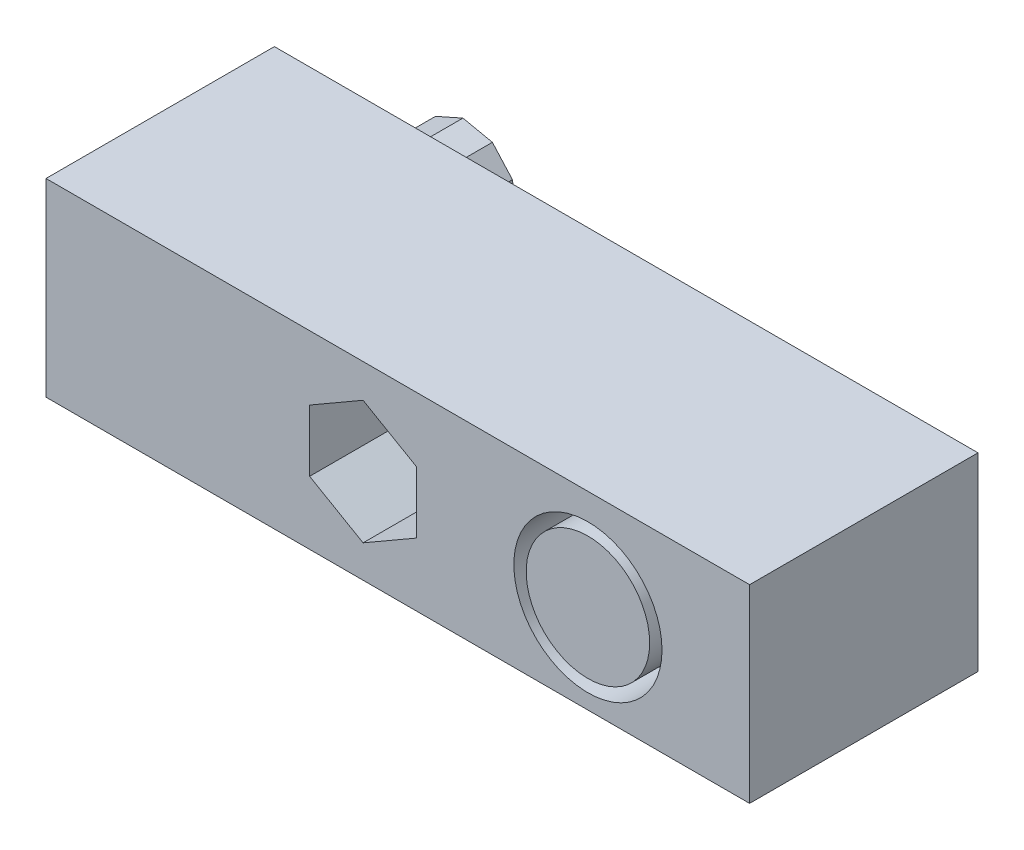
ISO-10303-21;
HEADER;
FILE_DESCRIPTION(('STEP AP214'),'2;1');
FILE_NAME('part.step','',(''),(''),'','','');
FILE_SCHEMA(('AUTOMOTIVE_DESIGN { 1 0 10303 214 1 1 1 1 }'));
ENDSEC;
DATA;
#1=APPLICATION_CONTEXT('core data for automotive mechanical design processes');
#2=APPLICATION_PROTOCOL_DEFINITION('international standard','automotive_design',2000,#1);
#3=PRODUCT_CONTEXT('',#1,'mechanical');
#4=PRODUCT('Part','Part','',(#3));
#5=PRODUCT_RELATED_PRODUCT_CATEGORY('part','',(#4));
#6=PRODUCT_DEFINITION_FORMATION('','',#4);
#7=PRODUCT_DEFINITION_CONTEXT('part definition',#1,'design');
#8=PRODUCT_DEFINITION('design','',#6,#7);
#9=PRODUCT_DEFINITION_SHAPE('','',#8);
#10=(LENGTH_UNIT() NAMED_UNIT(*) SI_UNIT(.MILLI.,.METRE.));
#11=(NAMED_UNIT(*) PLANE_ANGLE_UNIT() SI_UNIT($,.RADIAN.));
#12=(NAMED_UNIT(*) SI_UNIT($,.STERADIAN.) SOLID_ANGLE_UNIT());
#13=UNCERTAINTY_MEASURE_WITH_UNIT(LENGTH_MEASURE(1.E-05),#10,'distance_accuracy_value','');
#14=(GEOMETRIC_REPRESENTATION_CONTEXT(3) GLOBAL_UNCERTAINTY_ASSIGNED_CONTEXT((#13)) GLOBAL_UNIT_ASSIGNED_CONTEXT((#10,
#11,#12)) REPRESENTATION_CONTEXT('',''));
#15=CARTESIAN_POINT('',(0.,0.,0.));
#16=DIRECTION('',(0.,0.,1.));
#17=DIRECTION('',(1.,0.,0.));
#18=AXIS2_PLACEMENT_3D('',#15,#16,#17);
#19=CARTESIAN_POINT('',(0.,0.,0.));
#20=DIRECTION('',(0.,0.,1.));
#21=DIRECTION('',(1.,0.,0.));
#22=AXIS2_PLACEMENT_3D('',#19,#20,#21);
#23=PLANE('',#22);
#24=CARTESIAN_POINT('',(36.4253404546133,-3.65790400571697,0.));
#25=DIRECTION('',(0.,0.,1.));
#26=DIRECTION('',(1.,0.,0.));
#27=AXIS2_PLACEMENT_3D('',#24,#25,#26);
#28=CIRCLE('',#27,12.);
#29=CARTESIAN_POINT('',(48.4253404546133,-3.65790400571697,0.));
#30=VERTEX_POINT('',#29);
#31=EDGE_CURVE('E47',#30,#30,#28,.T.);
#32=ORIENTED_EDGE('',*,*,#31,.T.);
#33=EDGE_LOOP('',(#32));
#34=FACE_BOUND('',#33,.T.);
#35=DIRECTION('',(-0.866025403784439,-0.499999999999999,0.));
#36=VECTOR('',#35,1.);
#37=CARTESIAN_POINT('',(0.,7.16721621822201,0.));
#38=LINE('',#37,#36);
#39=CARTESIAN_POINT('',(0.,7.16721621822201,0.));
#40=VERTEX_POINT('',#39);
#41=CARTESIAN_POINT('',(-8.66025403784439,2.16721621822202,0.));
#42=VERTEX_POINT('',#41);
#43=EDGE_CURVE('E408',#40,#42,#38,.T.);
#44=ORIENTED_EDGE('',*,*,#43,.T.);
#45=DIRECTION('',(0.,-1.,0.));
#46=VECTOR('',#45,1.);
#47=CARTESIAN_POINT('',(-8.66025403784439,2.16721621822202,0.));
#48=LINE('',#47,#46);
#49=CARTESIAN_POINT('',(-8.66025403784439,-7.83278378177798,0.));
#50=VERTEX_POINT('',#49);
#51=EDGE_CURVE('E411',#42,#50,#48,.T.);
#52=ORIENTED_EDGE('',*,*,#51,.T.);
#53=DIRECTION('',(0.866025403784439,-0.5,0.));
#54=VECTOR('',#53,1.);
#55=CARTESIAN_POINT('',(-8.66025403784439,-7.83278378177798,0.));
#56=LINE('',#55,#54);
#57=CARTESIAN_POINT('',(0.,-12.832783781778,0.));
#58=VERTEX_POINT('',#57);
#59=EDGE_CURVE('E420',#50,#58,#56,.T.);
#60=ORIENTED_EDGE('',*,*,#59,.T.);
#61=DIRECTION('',(0.866025403784438,0.5,0.));
#62=VECTOR('',#61,1.);
#63=CARTESIAN_POINT('',(0.,-12.832783781778,0.));
#64=LINE('',#63,#62);
#65=CARTESIAN_POINT('',(8.66025403784439,-7.83278378177798,0.));
#66=VERTEX_POINT('',#65);
#67=EDGE_CURVE('E417',#58,#66,#64,.T.);
#68=ORIENTED_EDGE('',*,*,#67,.T.);
#69=DIRECTION('',(0.,1.,0.));
#70=VECTOR('',#69,1.);
#71=CARTESIAN_POINT('',(8.66025403784439,-7.83278378177798,0.));
#72=LINE('',#71,#70);
#73=CARTESIAN_POINT('',(8.66025403784439,2.16721621822202,0.));
#74=VERTEX_POINT('',#73);
#75=EDGE_CURVE('E414',#66,#74,#72,.T.);
#76=ORIENTED_EDGE('',*,*,#75,.T.);
#77=DIRECTION('',(-0.866025403784439,0.5,0.));
#78=VECTOR('',#77,1.);
#79=CARTESIAN_POINT('',(8.66025403784439,2.16721621822202,0.));
#80=LINE('',#79,#78);
#81=EDGE_CURVE('E407',#74,#40,#80,.T.);
#82=ORIENTED_EDGE('',*,*,#81,.T.);
#83=EDGE_LOOP('',(#44,#52,#60,#68,#76,#82));
#84=FACE_BOUND('',#83,.T.);
#85=DIRECTION('',(0.,-1.,0.));
#86=VECTOR('',#85,1.);
#87=CARTESIAN_POINT('',(-51.3648384094754,12.6032994923858,0.));
#88=LINE('',#87,#86);
#89=CARTESIAN_POINT('',(-51.3648384094754,12.6032994923858,0.));
#90=VERTEX_POINT('',#89);
#91=CARTESIAN_POINT('',(-51.3648384094754,-18.0829949238579,0.));
#92=VERTEX_POINT('',#91);
#93=EDGE_CURVE('E348',#90,#92,#88,.T.);
#94=ORIENTED_EDGE('',*,*,#93,.F.);
#95=DIRECTION('',(-1.,0.,0.));
#96=VECTOR('',#95,1.);
#97=CARTESIAN_POINT('',(-51.3648384094754,12.6032994923858,0.));
#98=LINE('',#97,#96);
#99=CARTESIAN_POINT('',(62.6128265651438,12.6032994923858,0.));
#100=VERTEX_POINT('',#99);
#101=EDGE_CURVE('E357',#100,#90,#98,.T.);
#102=ORIENTED_EDGE('',*,*,#101,.F.);
#103=DIRECTION('',(0.,1.,0.));
#104=VECTOR('',#103,1.);
#105=CARTESIAN_POINT('',(62.6128265651438,12.6032994923858,0.));
#106=LINE('',#105,#104);
#107=CARTESIAN_POINT('',(62.6128265651438,-18.0829949238579,0.));
#108=VERTEX_POINT('',#107);
#109=EDGE_CURVE('E352',#108,#100,#106,.T.);
#110=ORIENTED_EDGE('',*,*,#109,.F.);
#111=DIRECTION('',(1.,0.,0.));
#112=VECTOR('',#111,1.);
#113=CARTESIAN_POINT('',(-51.3648384094754,-18.0829949238579,0.));
#114=LINE('',#113,#112);
#115=EDGE_CURVE('E353',#92,#108,#114,.T.);
#116=ORIENTED_EDGE('',*,*,#115,.F.);
#117=EDGE_LOOP('',(#94,#102,#110,#116));
#118=FACE_BOUND('',#117,.T.);
#119=DIRECTION('',(-0.978147600733811,0.207911690817733,0.));
#120=VECTOR('',#119,1.);
#121=CARTESIAN_POINT('',(-29.1756920213731,-7.84276653118196,0.));
#122=LINE('',#121,#120);
#123=CARTESIAN_POINT('',(-29.1756920213731,-7.84276653118196,0.));
#124=VERTEX_POINT('',#123);
#125=CARTESIAN_POINT('',(-33.9429833408936,-6.82944747982547,0.));
#126=VERTEX_POINT('',#125);
#127=EDGE_CURVE('E234',#124,#126,#122,.T.);
#128=ORIENTED_EDGE('',*,*,#127,.F.);
#129=DIRECTION('',(-0.913545457642611,-0.406736643075776,0.));
#130=VECTOR('',#129,1.);
#131=CARTESIAN_POINT('',(-24.7232583324902,-5.86041533345733,0.));
#132=LINE('',#131,#130);
#133=CARTESIAN_POINT('',(-24.7232583324902,-5.86041533345734,0.));
#134=VERTEX_POINT('',#133);
#135=EDGE_CURVE('E277',#134,#124,#132,.T.);
#136=ORIENTED_EDGE('',*,*,#135,.F.);
#137=DIRECTION('',(-0.500000000000021,-0.866025403784427,0.));
#138=VECTOR('',#137,1.);
#139=CARTESIAN_POINT('',(-22.2863606107433,-1.63958466654304,0.));
#140=LINE('',#139,#138);
#141=CARTESIAN_POINT('',(-22.2863606107433,-1.63958466654304,0.));
#142=VERTEX_POINT('',#141);
#143=EDGE_CURVE('E315',#142,#134,#140,.T.);
#144=ORIENTED_EDGE('',*,*,#143,.F.);
#145=DIRECTION('',(0.104528463267631,-0.994521895368276,0.));
#146=VECTOR('',#145,1.);
#147=CARTESIAN_POINT('',(-22.7958109587324,3.20751161555752,0.));
#148=LINE('',#147,#146);
#149=CARTESIAN_POINT('',(-22.7958109587324,3.20751161555752,0.));
#150=VERTEX_POINT('',#149);
#151=EDGE_CURVE('E312',#150,#142,#148,.T.);
#152=ORIENTED_EDGE('',*,*,#151,.F.);
#153=DIRECTION('',(0.669130606358842,-0.743144825477409,0.));
#154=VECTOR('',#153,1.);
#155=CARTESIAN_POINT('',(-26.0570166591063,6.8294474798252,0.));
#156=LINE('',#155,#154);
#157=CARTESIAN_POINT('',(-26.0570166591063,6.8294474798252,0.));
#158=VERTEX_POINT('',#157);
#159=EDGE_CURVE('E309',#158,#150,#156,.T.);
#160=ORIENTED_EDGE('',*,*,#159,.F.);
#161=DIRECTION('',(0.978147600733811,-0.207911690817735,0.));
#162=VECTOR('',#161,1.);
#163=CARTESIAN_POINT('',(-30.8243079786272,7.84276653118177,0.));
#164=LINE('',#163,#162);
#165=CARTESIAN_POINT('',(-30.8243079786272,7.84276653118177,0.));
#166=VERTEX_POINT('',#165);
#167=EDGE_CURVE('E306',#166,#158,#164,.T.);
#168=ORIENTED_EDGE('',*,*,#167,.F.);
#169=DIRECTION('',(0.913545457642601,0.406736643075799,0.));
#170=VECTOR('',#169,1.);
#171=CARTESIAN_POINT('',(-35.27674166751,5.86041533345704,0.));
#172=LINE('',#171,#170);
#173=CARTESIAN_POINT('',(-35.27674166751,5.86041533345704,0.));
#174=VERTEX_POINT('',#173);
#175=EDGE_CURVE('E303',#174,#166,#172,.T.);
#176=ORIENTED_EDGE('',*,*,#175,.F.);
#177=DIRECTION('',(0.5,0.866025403784439,0.));
#178=VECTOR('',#177,1.);
#179=CARTESIAN_POINT('',(-37.7136393892568,1.63958466654269,0.));
#180=LINE('',#179,#178);
#181=CARTESIAN_POINT('',(-37.7136393892568,1.63958466654269,0.));
#182=VERTEX_POINT('',#181);
#183=EDGE_CURVE('E300',#182,#174,#180,.T.);
#184=ORIENTED_EDGE('',*,*,#183,.F.);
#185=DIRECTION('',(-0.104528463267654,0.994521895368273,0.));
#186=VECTOR('',#185,1.);
#187=CARTESIAN_POINT('',(-37.2041890412675,-3.20751161555786,0.));
#188=LINE('',#187,#186);
#189=CARTESIAN_POINT('',(-37.2041890412675,-3.20751161555786,0.));
#190=VERTEX_POINT('',#189);
#191=EDGE_CURVE('E64',#190,#182,#188,.T.);
#192=ORIENTED_EDGE('',*,*,#191,.F.);
#193=DIRECTION('',(-0.669130606358858,0.743144825477394,0.));
#194=VECTOR('',#193,1.);
#195=CARTESIAN_POINT('',(-33.9429833408936,-6.82944747982547,0.));
#196=LINE('',#195,#194);
#197=EDGE_CURVE('E59',#126,#190,#196,.T.);
#198=ORIENTED_EDGE('',*,*,#197,.F.);
#199=EDGE_LOOP('',(#128,#136,#144,#152,#160,#168,#176,#184,#192,#198));
#200=FACE_BOUND('',#199,.T.);
#201=ADVANCED_FACE('F43',(#34,#84,#118,#200),#23,.F.);
#202=CARTESIAN_POINT('',(-51.3648384094754,12.6032994923858,37.));
#203=DIRECTION('',(1.,0.,0.));
#204=DIRECTION('',(0.,0.,-1.));
#205=AXIS2_PLACEMENT_3D('',#202,#203,#204);
#206=PLANE('',#205);
#207=ORIENTED_EDGE('',*,*,#93,.T.);
#208=DIRECTION('',(0.,0.,-1.));
#209=VECTOR('',#208,1.);
#210=CARTESIAN_POINT('',(-51.3648384094754,-18.0829949238579,37.));
#211=LINE('',#210,#209);
#212=CARTESIAN_POINT('',(-51.3648384094754,-18.0829949238579,37.));
#213=VERTEX_POINT('',#212);
#214=EDGE_CURVE('E349',#213,#92,#211,.T.);
#215=ORIENTED_EDGE('',*,*,#214,.F.);
#216=DIRECTION('',(0.,-1.,0.));
#217=VECTOR('',#216,1.);
#218=CARTESIAN_POINT('',(-51.3648384094754,12.6032994923858,37.));
#219=LINE('',#218,#217);
#220=CARTESIAN_POINT('',(-51.3648384094754,12.6032994923858,37.));
#221=VERTEX_POINT('',#220);
#222=EDGE_CURVE('E361',#221,#213,#219,.T.);
#223=ORIENTED_EDGE('',*,*,#222,.F.);
#224=DIRECTION('',(0.,0.,-1.));
#225=VECTOR('',#224,1.);
#226=CARTESIAN_POINT('',(-51.3648384094754,12.6032994923858,37.));
#227=LINE('',#226,#225);
#228=EDGE_CURVE('E362',#221,#90,#227,.T.);
#229=ORIENTED_EDGE('',*,*,#228,.T.);
#230=EDGE_LOOP('',(#207,#215,#223,#229));
#231=FACE_BOUND('',#230,.T.);
#232=ADVANCED_FACE('F461',(#231),#206,.F.);
#233=CARTESIAN_POINT('',(-51.3648384094754,-18.0829949238579,37.));
#234=DIRECTION('',(0.,1.,0.));
#235=DIRECTION('',(0.,0.,1.));
#236=AXIS2_PLACEMENT_3D('',#233,#234,#235);
#237=PLANE('',#236);
#238=ORIENTED_EDGE('',*,*,#115,.T.);
#239=DIRECTION('',(0.,0.,-1.));
#240=VECTOR('',#239,1.);
#241=CARTESIAN_POINT('',(62.6128265651438,-18.0829949238579,37.));
#242=LINE('',#241,#240);
#243=CARTESIAN_POINT('',(62.6128265651438,-18.0829949238579,37.));
#244=VERTEX_POINT('',#243);
#245=EDGE_CURVE('E354',#244,#108,#242,.T.);
#246=ORIENTED_EDGE('',*,*,#245,.F.);
#247=DIRECTION('',(1.,0.,0.));
#248=VECTOR('',#247,1.);
#249=CARTESIAN_POINT('',(-51.3648384094754,-18.0829949238579,37.));
#250=LINE('',#249,#248);
#251=EDGE_CURVE('E374',#213,#244,#250,.T.);
#252=ORIENTED_EDGE('',*,*,#251,.F.);
#253=ORIENTED_EDGE('',*,*,#214,.T.);
#254=EDGE_LOOP('',(#238,#246,#252,#253));
#255=FACE_BOUND('',#254,.T.);
#256=ADVANCED_FACE('F464',(#255),#237,.F.);
#257=CARTESIAN_POINT('',(62.6128265651438,12.6032994923858,37.));
#258=DIRECTION('',(-1.,0.,0.));
#259=DIRECTION('',(0.,0.,1.));
#260=AXIS2_PLACEMENT_3D('',#257,#258,#259);
#261=PLANE('',#260);
#262=ORIENTED_EDGE('',*,*,#109,.T.);
#263=DIRECTION('',(0.,0.,-1.));
#264=VECTOR('',#263,1.);
#265=CARTESIAN_POINT('',(62.6128265651438,12.6032994923858,37.));
#266=LINE('',#265,#264);
#267=CARTESIAN_POINT('',(62.6128265651438,12.6032994923858,37.));
#268=VERTEX_POINT('',#267);
#269=EDGE_CURVE('E358',#268,#100,#266,.T.);
#270=ORIENTED_EDGE('',*,*,#269,.F.);
#271=DIRECTION('',(0.,1.,0.));
#272=VECTOR('',#271,1.);
#273=CARTESIAN_POINT('',(62.6128265651438,12.6032994923858,37.));
#274=LINE('',#273,#272);
#275=EDGE_CURVE('E372',#244,#268,#274,.T.);
#276=ORIENTED_EDGE('',*,*,#275,.F.);
#277=ORIENTED_EDGE('',*,*,#245,.T.);
#278=EDGE_LOOP('',(#262,#270,#276,#277));
#279=FACE_BOUND('',#278,.T.);
#280=ADVANCED_FACE('F469',(#279),#261,.F.);
#281=CARTESIAN_POINT('',(-51.3648384094754,12.6032994923858,37.));
#282=DIRECTION('',(0.,-1.,0.));
#283=DIRECTION('',(0.,0.,-1.));
#284=AXIS2_PLACEMENT_3D('',#281,#282,#283);
#285=PLANE('',#284);
#286=ORIENTED_EDGE('',*,*,#101,.T.);
#287=ORIENTED_EDGE('',*,*,#228,.F.);
#288=DIRECTION('',(-1.,0.,0.));
#289=VECTOR('',#288,1.);
#290=CARTESIAN_POINT('',(-51.3648384094754,12.6032994923858,37.));
#291=LINE('',#290,#289);
#292=EDGE_CURVE('E370',#268,#221,#291,.T.);
#293=ORIENTED_EDGE('',*,*,#292,.F.);
#294=ORIENTED_EDGE('',*,*,#269,.T.);
#295=EDGE_LOOP('',(#286,#287,#293,#294));
#296=FACE_BOUND('',#295,.T.);
#297=ADVANCED_FACE('F453',(#296),#285,.F.);
#298=CARTESIAN_POINT('',(0.,0.,37.));
#299=DIRECTION('',(0.,0.,1.));
#300=DIRECTION('',(1.,0.,0.));
#301=AXIS2_PLACEMENT_3D('',#298,#299,#300);
#302=PLANE('',#301);
#303=CARTESIAN_POINT('',(36.4253404546133,-3.65790400571697,37.));
#304=DIRECTION('',(0.,0.,1.));
#305=DIRECTION('',(1.,0.,0.));
#306=AXIS2_PLACEMENT_3D('',#303,#304,#305);
#307=CIRCLE('',#306,12.);
#308=CARTESIAN_POINT('',(48.4253404546133,-3.65790400571697,37.));
#309=VERTEX_POINT('',#308);
#310=EDGE_CURVE('E12',#309,#309,#307,.T.);
#311=ORIENTED_EDGE('',*,*,#310,.F.);
#312=EDGE_LOOP('',(#311));
#313=FACE_BOUND('',#312,.T.);
#314=DIRECTION('',(0.,-1.,0.));
#315=VECTOR('',#314,1.);
#316=CARTESIAN_POINT('',(-8.66025403784439,2.16721621822202,37.));
#317=LINE('',#316,#315);
#318=CARTESIAN_POINT('',(-8.66025403784439,2.16721621822202,37.));
#319=VERTEX_POINT('',#318);
#320=CARTESIAN_POINT('',(-8.66025403784439,-7.83278378177798,37.));
#321=VERTEX_POINT('',#320);
#322=EDGE_CURVE('E395',#319,#321,#317,.T.);
#323=ORIENTED_EDGE('',*,*,#322,.F.);
#324=DIRECTION('',(-0.866025403784439,-0.499999999999999,0.));
#325=VECTOR('',#324,1.);
#326=CARTESIAN_POINT('',(0.,7.16721621822201,37.));
#327=LINE('',#326,#325);
#328=CARTESIAN_POINT('',(0.,7.16721621822201,37.));
#329=VERTEX_POINT('',#328);
#330=EDGE_CURVE('E392',#329,#319,#327,.T.);
#331=ORIENTED_EDGE('',*,*,#330,.F.);
#332=DIRECTION('',(-0.866025403784439,0.5,0.));
#333=VECTOR('',#332,1.);
#334=CARTESIAN_POINT('',(8.66025403784439,2.16721621822202,37.));
#335=LINE('',#334,#333);
#336=CARTESIAN_POINT('',(8.66025403784439,2.16721621822202,37.));
#337=VERTEX_POINT('',#336);
#338=EDGE_CURVE('E389',#337,#329,#335,.T.);
#339=ORIENTED_EDGE('',*,*,#338,.F.);
#340=DIRECTION('',(0.,1.,0.));
#341=VECTOR('',#340,1.);
#342=CARTESIAN_POINT('',(8.66025403784439,-7.83278378177798,37.));
#343=LINE('',#342,#341);
#344=CARTESIAN_POINT('',(8.66025403784439,-7.83278378177798,37.));
#345=VERTEX_POINT('',#344);
#346=EDGE_CURVE('E386',#345,#337,#343,.T.);
#347=ORIENTED_EDGE('',*,*,#346,.F.);
#348=DIRECTION('',(0.866025403784438,0.5,0.));
#349=VECTOR('',#348,1.);
#350=CARTESIAN_POINT('',(0.,-12.832783781778,37.));
#351=LINE('',#350,#349);
#352=CARTESIAN_POINT('',(0.,-12.832783781778,37.));
#353=VERTEX_POINT('',#352);
#354=EDGE_CURVE('E383',#353,#345,#351,.T.);
#355=ORIENTED_EDGE('',*,*,#354,.F.);
#356=DIRECTION('',(0.866025403784439,-0.5,0.));
#357=VECTOR('',#356,1.);
#358=CARTESIAN_POINT('',(-8.66025403784439,-7.83278378177798,37.));
#359=LINE('',#358,#357);
#360=EDGE_CURVE('E380',#321,#353,#359,.T.);
#361=ORIENTED_EDGE('',*,*,#360,.F.);
#362=EDGE_LOOP('',(#323,#331,#339,#347,#355,#361));
#363=FACE_BOUND('',#362,.T.);
#364=ORIENTED_EDGE('',*,*,#222,.T.);
#365=ORIENTED_EDGE('',*,*,#251,.T.);
#366=ORIENTED_EDGE('',*,*,#275,.T.);
#367=ORIENTED_EDGE('',*,*,#292,.T.);
#368=EDGE_LOOP('',(#364,#365,#366,#367));
#369=FACE_BOUND('',#368,.T.);
#370=ADVANCED_FACE('F45',(#313,#363,#369),#302,.T.);
#371=CARTESIAN_POINT('',(-8.66025403784439,2.16721621822202,0.));
#372=DIRECTION('',(-1.,0.,0.));
#373=DIRECTION('',(0.,0.,1.));
#374=AXIS2_PLACEMENT_3D('',#371,#372,#373);
#375=PLANE('',#374);
#376=ORIENTED_EDGE('',*,*,#322,.T.);
#377=DIRECTION('',(0.,0.,1.));
#378=VECTOR('',#377,1.);
#379=CARTESIAN_POINT('',(-8.66025403784439,-7.83278378177798,0.));
#380=LINE('',#379,#378);
#381=EDGE_CURVE('E52',#50,#321,#380,.T.);
#382=ORIENTED_EDGE('',*,*,#381,.F.);
#383=ORIENTED_EDGE('',*,*,#51,.F.);
#384=DIRECTION('',(0.,0.,1.));
#385=VECTOR('',#384,1.);
#386=CARTESIAN_POINT('',(-8.66025403784439,2.16721621822202,0.));
#387=LINE('',#386,#385);
#388=EDGE_CURVE('E393',#42,#319,#387,.T.);
#389=ORIENTED_EDGE('',*,*,#388,.T.);
#390=EDGE_LOOP('',(#376,#382,#383,#389));
#391=FACE_BOUND('',#390,.T.);
#392=ADVANCED_FACE('F430',(#391),#375,.F.);
#393=CARTESIAN_POINT('',(0.,7.16721621822201,0.));
#394=DIRECTION('',(-0.499999999999999,0.866025403784439,0.));
#395=DIRECTION('',(-0.866025403784439,-0.499999999999999,0.));
#396=AXIS2_PLACEMENT_3D('',#393,#394,#395);
#397=PLANE('',#396);
#398=ORIENTED_EDGE('',*,*,#330,.T.);
#399=ORIENTED_EDGE('',*,*,#388,.F.);
#400=ORIENTED_EDGE('',*,*,#43,.F.);
#401=DIRECTION('',(0.,0.,1.));
#402=VECTOR('',#401,1.);
#403=CARTESIAN_POINT('',(0.,7.16721621822201,0.));
#404=LINE('',#403,#402);
#405=EDGE_CURVE('E390',#40,#329,#404,.T.);
#406=ORIENTED_EDGE('',*,*,#405,.T.);
#407=EDGE_LOOP('',(#398,#399,#400,#406));
#408=FACE_BOUND('',#407,.T.);
#409=ADVANCED_FACE('F449',(#408),#397,.F.);
#410=CARTESIAN_POINT('',(8.66025403784439,2.16721621822202,0.));
#411=DIRECTION('',(0.5,0.866025403784439,0.));
#412=DIRECTION('',(-0.866025403784439,0.5,0.));
#413=AXIS2_PLACEMENT_3D('',#410,#411,#412);
#414=PLANE('',#413);
#415=ORIENTED_EDGE('',*,*,#338,.T.);
#416=ORIENTED_EDGE('',*,*,#405,.F.);
#417=ORIENTED_EDGE('',*,*,#81,.F.);
#418=DIRECTION('',(0.,0.,1.));
#419=VECTOR('',#418,1.);
#420=CARTESIAN_POINT('',(8.66025403784439,2.16721621822202,0.));
#421=LINE('',#420,#419);
#422=EDGE_CURVE('E387',#74,#337,#421,.T.);
#423=ORIENTED_EDGE('',*,*,#422,.T.);
#424=EDGE_LOOP('',(#415,#416,#417,#423));
#425=FACE_BOUND('',#424,.T.);
#426=ADVANCED_FACE('F446',(#425),#414,.F.);
#427=CARTESIAN_POINT('',(8.66025403784439,-7.83278378177798,0.));
#428=DIRECTION('',(1.,0.,0.));
#429=DIRECTION('',(0.,0.,-1.));
#430=AXIS2_PLACEMENT_3D('',#427,#428,#429);
#431=PLANE('',#430);
#432=ORIENTED_EDGE('',*,*,#346,.T.);
#433=ORIENTED_EDGE('',*,*,#422,.F.);
#434=ORIENTED_EDGE('',*,*,#75,.F.);
#435=DIRECTION('',(0.,0.,1.));
#436=VECTOR('',#435,1.);
#437=CARTESIAN_POINT('',(8.66025403784439,-7.83278378177798,0.));
#438=LINE('',#437,#436);
#439=EDGE_CURVE('E384',#66,#345,#438,.T.);
#440=ORIENTED_EDGE('',*,*,#439,.T.);
#441=EDGE_LOOP('',(#432,#433,#434,#440));
#442=FACE_BOUND('',#441,.T.);
#443=ADVANCED_FACE('F443',(#442),#431,.F.);
#444=CARTESIAN_POINT('',(0.,-12.832783781778,0.));
#445=DIRECTION('',(0.5,-0.866025403784438,0.));
#446=DIRECTION('',(0.866025403784438,0.5,0.));
#447=AXIS2_PLACEMENT_3D('',#444,#445,#446);
#448=PLANE('',#447);
#449=ORIENTED_EDGE('',*,*,#354,.T.);
#450=ORIENTED_EDGE('',*,*,#439,.F.);
#451=ORIENTED_EDGE('',*,*,#67,.F.);
#452=DIRECTION('',(0.,0.,1.));
#453=VECTOR('',#452,1.);
#454=CARTESIAN_POINT('',(0.,-12.832783781778,0.));
#455=LINE('',#454,#453);
#456=EDGE_CURVE('E381',#58,#353,#455,.T.);
#457=ORIENTED_EDGE('',*,*,#456,.T.);
#458=EDGE_LOOP('',(#449,#450,#451,#457));
#459=FACE_BOUND('',#458,.T.);
#460=ADVANCED_FACE('F438',(#459),#448,.F.);
#461=CARTESIAN_POINT('',(-8.66025403784439,-7.83278378177798,0.));
#462=DIRECTION('',(-0.5,-0.866025403784439,0.));
#463=DIRECTION('',(0.866025403784439,-0.5,0.));
#464=AXIS2_PLACEMENT_3D('',#461,#462,#463);
#465=PLANE('',#464);
#466=ORIENTED_EDGE('',*,*,#360,.T.);
#467=ORIENTED_EDGE('',*,*,#456,.F.);
#468=ORIENTED_EDGE('',*,*,#59,.F.);
#469=ORIENTED_EDGE('',*,*,#381,.T.);
#470=EDGE_LOOP('',(#466,#467,#468,#469));
#471=FACE_BOUND('',#470,.T.);
#472=ADVANCED_FACE('F435',(#471),#465,.F.);
#473=CARTESIAN_POINT('',(36.4253404546133,-3.65790400571697,0.));
#474=DIRECTION('',(0.,0.,1.));
#475=DIRECTION('',(1.,0.,0.));
#476=AXIS2_PLACEMENT_3D('',#473,#474,#475);
#477=CYLINDRICAL_SURFACE('',#476,12.);
#478=ORIENTED_EDGE('',*,*,#31,.F.);
#479=EDGE_LOOP('',(#478));
#480=FACE_BOUND('',#479,.T.);
#481=ORIENTED_EDGE('',*,*,#310,.T.);
#482=EDGE_LOOP('',(#481));
#483=FACE_BOUND('',#482,.T.);
#484=ADVANCED_FACE('F537',(#480,#483),#477,.F.);
#485=CARTESIAN_POINT('',(0.,0.,-10.));
#486=DIRECTION('',(0.,0.,-1.));
#487=DIRECTION('',(-1.,0.,0.));
#488=AXIS2_PLACEMENT_3D('',#485,#486,#487);
#489=PLANE('',#488);
#490=DIRECTION('',(-0.978147600733811,0.207911690817733,0.));
#491=VECTOR('',#490,1.);
#492=CARTESIAN_POINT('',(-29.1756920213731,-7.84276653118196,-10.));
#493=LINE('',#492,#491);
#494=CARTESIAN_POINT('',(-29.1756920213731,-7.84276653118196,-10.));
#495=VERTEX_POINT('',#494);
#496=CARTESIAN_POINT('',(-33.9429833408936,-6.82944747982547,-10.));
#497=VERTEX_POINT('',#496);
#498=EDGE_CURVE('E273',#495,#497,#493,.T.);
#499=ORIENTED_EDGE('',*,*,#498,.T.);
#500=DIRECTION('',(-0.669130606358858,0.743144825477394,0.));
#501=VECTOR('',#500,1.);
#502=CARTESIAN_POINT('',(-33.9429833408936,-6.82944747982547,-10.));
#503=LINE('',#502,#501);
#504=CARTESIAN_POINT('',(-37.2041890412675,-3.20751161555786,-10.));
#505=VERTEX_POINT('',#504);
#506=EDGE_CURVE('E276',#497,#505,#503,.T.);
#507=ORIENTED_EDGE('',*,*,#506,.T.);
#508=DIRECTION('',(-0.104528463267654,0.994521895368273,0.));
#509=VECTOR('',#508,1.);
#510=CARTESIAN_POINT('',(-37.2041890412675,-3.20751161555786,-10.));
#511=LINE('',#510,#509);
#512=CARTESIAN_POINT('',(-37.7136393892568,1.63958466654269,-10.));
#513=VERTEX_POINT('',#512);
#514=EDGE_CURVE('E279',#505,#513,#511,.T.);
#515=ORIENTED_EDGE('',*,*,#514,.T.);
#516=DIRECTION('',(0.5,0.866025403784439,0.));
#517=VECTOR('',#516,1.);
#518=CARTESIAN_POINT('',(-37.7136393892568,1.63958466654269,-10.));
#519=LINE('',#518,#517);
#520=CARTESIAN_POINT('',(-35.27674166751,5.86041533345704,-10.));
#521=VERTEX_POINT('',#520);
#522=EDGE_CURVE('E281',#513,#521,#519,.T.);
#523=ORIENTED_EDGE('',*,*,#522,.T.);
#524=DIRECTION('',(0.913545457642601,0.406736643075799,0.));
#525=VECTOR('',#524,1.);
#526=CARTESIAN_POINT('',(-35.27674166751,5.86041533345704,-10.));
#527=LINE('',#526,#525);
#528=CARTESIAN_POINT('',(-30.8243079786272,7.84276653118177,-10.));
#529=VERTEX_POINT('',#528);
#530=EDGE_CURVE('E283',#521,#529,#527,.T.);
#531=ORIENTED_EDGE('',*,*,#530,.T.);
#532=DIRECTION('',(0.978147600733811,-0.207911690817735,0.));
#533=VECTOR('',#532,1.);
#534=CARTESIAN_POINT('',(-30.8243079786272,7.84276653118177,-10.));
#535=LINE('',#534,#533);
#536=CARTESIAN_POINT('',(-26.0570166591063,6.8294474798252,-10.));
#537=VERTEX_POINT('',#536);
#538=EDGE_CURVE('E285',#529,#537,#535,.T.);
#539=ORIENTED_EDGE('',*,*,#538,.T.);
#540=DIRECTION('',(0.669130606358842,-0.743144825477409,0.));
#541=VECTOR('',#540,1.);
#542=CARTESIAN_POINT('',(-26.0570166591063,6.8294474798252,-10.));
#543=LINE('',#542,#541);
#544=CARTESIAN_POINT('',(-22.7958109587324,3.20751161555752,-10.));
#545=VERTEX_POINT('',#544);
#546=EDGE_CURVE('E287',#537,#545,#543,.T.);
#547=ORIENTED_EDGE('',*,*,#546,.T.);
#548=DIRECTION('',(0.104528463267631,-0.994521895368276,0.));
#549=VECTOR('',#548,1.);
#550=CARTESIAN_POINT('',(-22.7958109587324,3.20751161555752,-10.));
#551=LINE('',#550,#549);
#552=CARTESIAN_POINT('',(-22.2863606107433,-1.63958466654304,-10.));
#553=VERTEX_POINT('',#552);
#554=EDGE_CURVE('E289',#545,#553,#551,.T.);
#555=ORIENTED_EDGE('',*,*,#554,.T.);
#556=DIRECTION('',(-0.500000000000021,-0.866025403784427,0.));
#557=VECTOR('',#556,1.);
#558=CARTESIAN_POINT('',(-22.2863606107433,-1.63958466654304,-10.));
#559=LINE('',#558,#557);
#560=CARTESIAN_POINT('',(-24.7232583324902,-5.86041533345733,-10.));
#561=VERTEX_POINT('',#560);
#562=EDGE_CURVE('E291',#553,#561,#559,.T.);
#563=ORIENTED_EDGE('',*,*,#562,.T.);
#564=DIRECTION('',(-0.913545457642611,-0.406736643075776,0.));
#565=VECTOR('',#564,1.);
#566=CARTESIAN_POINT('',(-24.7232583324902,-5.86041533345733,-10.));
#567=LINE('',#566,#565);
#568=EDGE_CURVE('E293',#561,#495,#567,.T.);
#569=ORIENTED_EDGE('',*,*,#568,.T.);
#570=EDGE_LOOP('',(#499,#507,#515,#523,#531,#539,#547,#555,#563,#569));
#571=FACE_BOUND('',#570,.T.);
#572=DIRECTION('',(0.013865554910705,-0.999903868572883,0.));
#573=VECTOR('',#572,1.);
#574=CARTESIAN_POINT('',(-24.3666962313386,3.35738523853953,-10.));
#575=LINE('',#574,#573);
#576=CARTESIAN_POINT('',(-24.3666962313386,3.35738523853953,-10.));
#577=VERTEX_POINT('',#576);
#578=CARTESIAN_POINT('',(-24.2757672088032,-3.1998915516256,-10.));
#579=VERTEX_POINT('',#578);
#580=EDGE_CURVE('E226',#577,#579,#575,.T.);
#581=ORIENTED_EDGE('',*,*,#580,.F.);
#582=DIRECTION('',(0.872874928981806,-0.487944011496203,0.));
#583=VECTOR('',#582,1.);
#584=CARTESIAN_POINT('',(-30.0909290225354,6.55727679016513,-10.));
#585=LINE('',#584,#583);
#586=CARTESIAN_POINT('',(-30.0909290225354,6.55727679016513,-10.));
#587=VERTEX_POINT('',#586);
#588=EDGE_CURVE('E216',#587,#577,#585,.T.);
#589=ORIENTED_EDGE('',*,*,#588,.F.);
#590=DIRECTION('',(0.859009374071101,0.511959857076681,0.));
#591=VECTOR('',#590,1.);
#592=CARTESIAN_POINT('',(-35.7242327911968,3.19989155162559,-10.));
#593=LINE('',#592,#591);
#594=CARTESIAN_POINT('',(-35.7242327911968,3.19989155162559,-10.));
#595=VERTEX_POINT('',#594);
#596=EDGE_CURVE('E249',#595,#587,#593,.T.);
#597=ORIENTED_EDGE('',*,*,#596,.F.);
#598=DIRECTION('',(-0.013865554910705,0.999903868572883,0.));
#599=VECTOR('',#598,1.);
#600=CARTESIAN_POINT('',(-35.6333037686614,-3.35738523853953,-10.));
#601=LINE('',#600,#599);
#602=CARTESIAN_POINT('',(-35.6333037686614,-3.35738523853953,-10.));
#603=VERTEX_POINT('',#602);
#604=EDGE_CURVE('E246',#603,#595,#601,.T.);
#605=ORIENTED_EDGE('',*,*,#604,.F.);
#606=DIRECTION('',(-0.872874928981806,0.487944011496203,0.));
#607=VECTOR('',#606,1.);
#608=CARTESIAN_POINT('',(-29.9090709774646,-6.55727679016512,-10.));
#609=LINE('',#608,#607);
#610=CARTESIAN_POINT('',(-29.9090709774646,-6.55727679016512,-10.));
#611=VERTEX_POINT('',#610);
#612=EDGE_CURVE('E242',#611,#603,#609,.T.);
#613=ORIENTED_EDGE('',*,*,#612,.F.);
#614=DIRECTION('',(-0.859009374071101,-0.51195985707668,0.));
#615=VECTOR('',#614,1.);
#616=CARTESIAN_POINT('',(-24.2757672088032,-3.1998915516256,-10.));
#617=LINE('',#616,#615);
#618=EDGE_CURVE('E240',#579,#611,#617,.T.);
#619=ORIENTED_EDGE('',*,*,#618,.F.);
#620=EDGE_LOOP('',(#581,#589,#597,#605,#613,#619));
#621=FACE_BOUND('',#620,.T.);
#622=ADVANCED_FACE('F238',(#571,#621),#489,.T.);
#623=CARTESIAN_POINT('',(-29.1756920213731,-7.84276653118196,-10.));
#624=DIRECTION('',(0.207911690817733,0.978147600733811,0.));
#625=DIRECTION('',(-0.978147600733811,0.207911690817733,0.));
#626=AXIS2_PLACEMENT_3D('',#623,#624,#625);
#627=PLANE('',#626);
#628=ORIENTED_EDGE('',*,*,#127,.T.);
#629=DIRECTION('',(0.,0.,1.));
#630=VECTOR('',#629,1.);
#631=CARTESIAN_POINT('',(-33.9429833408936,-6.82944747982547,-10.));
#632=LINE('',#631,#630);
#633=EDGE_CURVE('E346',#497,#126,#632,.T.);
#634=ORIENTED_EDGE('',*,*,#633,.F.);
#635=ORIENTED_EDGE('',*,*,#498,.F.);
#636=DIRECTION('',(0.,0.,1.));
#637=VECTOR('',#636,1.);
#638=CARTESIAN_POINT('',(-29.1756920213731,-7.84276653118196,-10.));
#639=LINE('',#638,#637);
#640=EDGE_CURVE('E295',#495,#124,#639,.T.);
#641=ORIENTED_EDGE('',*,*,#640,.T.);
#642=EDGE_LOOP('',(#628,#634,#635,#641));
#643=FACE_BOUND('',#642,.T.);
#644=ADVANCED_FACE('F483',(#643),#627,.F.);
#645=CARTESIAN_POINT('',(-33.9429833408936,-6.82944747982547,-10.));
#646=DIRECTION('',(0.743144825477394,0.669130606358858,0.));
#647=DIRECTION('',(-0.669130606358858,0.743144825477394,0.));
#648=AXIS2_PLACEMENT_3D('',#645,#646,#647);
#649=PLANE('',#648);
#650=ORIENTED_EDGE('',*,*,#197,.T.);
#651=DIRECTION('',(0.,0.,1.));
#652=VECTOR('',#651,1.);
#653=CARTESIAN_POINT('',(-37.2041890412675,-3.20751161555786,-10.));
#654=LINE('',#653,#652);
#655=EDGE_CURVE('E343',#505,#190,#654,.T.);
#656=ORIENTED_EDGE('',*,*,#655,.F.);
#657=ORIENTED_EDGE('',*,*,#506,.F.);
#658=ORIENTED_EDGE('',*,*,#633,.T.);
#659=EDGE_LOOP('',(#650,#656,#657,#658));
#660=FACE_BOUND('',#659,.T.);
#661=ADVANCED_FACE('F514',(#660),#649,.F.);
#662=CARTESIAN_POINT('',(-37.2041890412675,-3.20751161555786,-10.));
#663=DIRECTION('',(0.994521895368273,0.104528463267654,0.));
#664=DIRECTION('',(-0.104528463267654,0.994521895368273,0.));
#665=AXIS2_PLACEMENT_3D('',#662,#663,#664);
#666=PLANE('',#665);
#667=ORIENTED_EDGE('',*,*,#191,.T.);
#668=DIRECTION('',(0.,0.,1.));
#669=VECTOR('',#668,1.);
#670=CARTESIAN_POINT('',(-37.7136393892568,1.63958466654269,-10.));
#671=LINE('',#670,#669);
#672=EDGE_CURVE('E340',#513,#182,#671,.T.);
#673=ORIENTED_EDGE('',*,*,#672,.F.);
#674=ORIENTED_EDGE('',*,*,#514,.F.);
#675=ORIENTED_EDGE('',*,*,#655,.T.);
#676=EDGE_LOOP('',(#667,#673,#674,#675));
#677=FACE_BOUND('',#676,.T.);
#678=ADVANCED_FACE('F512',(#677),#666,.F.);
#679=CARTESIAN_POINT('',(-37.7136393892568,1.63958466654269,-10.));
#680=DIRECTION('',(0.866025403784438,-0.5,0.));
#681=DIRECTION('',(0.5,0.866025403784438,0.));
#682=AXIS2_PLACEMENT_3D('',#679,#680,#681);
#683=PLANE('',#682);
#684=ORIENTED_EDGE('',*,*,#183,.T.);
#685=DIRECTION('',(0.,0.,1.));
#686=VECTOR('',#685,1.);
#687=CARTESIAN_POINT('',(-35.27674166751,5.86041533345704,-10.));
#688=LINE('',#687,#686);
#689=EDGE_CURVE('E337',#521,#174,#688,.T.);
#690=ORIENTED_EDGE('',*,*,#689,.F.);
#691=ORIENTED_EDGE('',*,*,#522,.F.);
#692=ORIENTED_EDGE('',*,*,#672,.T.);
#693=EDGE_LOOP('',(#684,#690,#691,#692));
#694=FACE_BOUND('',#693,.T.);
#695=ADVANCED_FACE('F507',(#694),#683,.F.);
#696=CARTESIAN_POINT('',(-35.27674166751,5.86041533345704,-10.));
#697=DIRECTION('',(0.406736643075799,-0.913545457642601,0.));
#698=DIRECTION('',(0.913545457642601,0.406736643075799,0.));
#699=AXIS2_PLACEMENT_3D('',#696,#697,#698);
#700=PLANE('',#699);
#701=ORIENTED_EDGE('',*,*,#175,.T.);
#702=DIRECTION('',(0.,0.,1.));
#703=VECTOR('',#702,1.);
#704=CARTESIAN_POINT('',(-30.8243079786272,7.84276653118177,-10.));
#705=LINE('',#704,#703);
#706=EDGE_CURVE('E334',#529,#166,#705,.T.);
#707=ORIENTED_EDGE('',*,*,#706,.F.);
#708=ORIENTED_EDGE('',*,*,#530,.F.);
#709=ORIENTED_EDGE('',*,*,#689,.T.);
#710=EDGE_LOOP('',(#701,#707,#708,#709));
#711=FACE_BOUND('',#710,.T.);
#712=ADVANCED_FACE('F504',(#711),#700,.F.);
#713=CARTESIAN_POINT('',(-30.8243079786272,7.84276653118177,-10.));
#714=DIRECTION('',(-0.207911690817735,-0.978147600733811,0.));
#715=DIRECTION('',(0.978147600733811,-0.207911690817735,0.));
#716=AXIS2_PLACEMENT_3D('',#713,#714,#715);
#717=PLANE('',#716);
#718=ORIENTED_EDGE('',*,*,#167,.T.);
#719=DIRECTION('',(0.,0.,1.));
#720=VECTOR('',#719,1.);
#721=CARTESIAN_POINT('',(-26.0570166591063,6.8294474798252,-10.));
#722=LINE('',#721,#720);
#723=EDGE_CURVE('E331',#537,#158,#722,.T.);
#724=ORIENTED_EDGE('',*,*,#723,.F.);
#725=ORIENTED_EDGE('',*,*,#538,.F.);
#726=ORIENTED_EDGE('',*,*,#706,.T.);
#727=EDGE_LOOP('',(#718,#724,#725,#726));
#728=FACE_BOUND('',#727,.T.);
#729=ADVANCED_FACE('F499',(#728),#717,.F.);
#730=CARTESIAN_POINT('',(-26.0570166591063,6.8294474798252,-10.));
#731=DIRECTION('',(-0.743144825477409,-0.669130606358842,0.));
#732=DIRECTION('',(0.669130606358842,-0.743144825477409,0.));
#733=AXIS2_PLACEMENT_3D('',#730,#731,#732);
#734=PLANE('',#733);
#735=ORIENTED_EDGE('',*,*,#159,.T.);
#736=DIRECTION('',(0.,0.,1.));
#737=VECTOR('',#736,1.);
#738=CARTESIAN_POINT('',(-22.7958109587324,3.20751161555752,-10.));
#739=LINE('',#738,#737);
#740=EDGE_CURVE('E328',#545,#150,#739,.T.);
#741=ORIENTED_EDGE('',*,*,#740,.F.);
#742=ORIENTED_EDGE('',*,*,#546,.F.);
#743=ORIENTED_EDGE('',*,*,#723,.T.);
#744=EDGE_LOOP('',(#735,#741,#742,#743));
#745=FACE_BOUND('',#744,.T.);
#746=ADVANCED_FACE('F496',(#745),#734,.F.);
#747=CARTESIAN_POINT('',(-22.7958109587324,3.20751161555752,-10.));
#748=DIRECTION('',(-0.994521895368276,-0.104528463267631,0.));
#749=DIRECTION('',(0.104528463267631,-0.994521895368276,0.));
#750=AXIS2_PLACEMENT_3D('',#747,#748,#749);
#751=PLANE('',#750);
#752=ORIENTED_EDGE('',*,*,#151,.T.);
#753=DIRECTION('',(0.,0.,1.));
#754=VECTOR('',#753,1.);
#755=CARTESIAN_POINT('',(-22.2863606107433,-1.63958466654304,-10.));
#756=LINE('',#755,#754);
#757=EDGE_CURVE('E325',#553,#142,#756,.T.);
#758=ORIENTED_EDGE('',*,*,#757,.F.);
#759=ORIENTED_EDGE('',*,*,#554,.F.);
#760=ORIENTED_EDGE('',*,*,#740,.T.);
#761=EDGE_LOOP('',(#752,#758,#759,#760));
#762=FACE_BOUND('',#761,.T.);
#763=ADVANCED_FACE('F492',(#762),#751,.F.);
#764=CARTESIAN_POINT('',(-22.2863606107433,-1.63958466654304,-10.));
#765=DIRECTION('',(-0.866025403784427,0.500000000000021,0.));
#766=DIRECTION('',(-0.500000000000021,-0.866025403784427,0.));
#767=AXIS2_PLACEMENT_3D('',#764,#765,#766);
#768=PLANE('',#767);
#769=ORIENTED_EDGE('',*,*,#143,.T.);
#770=DIRECTION('',(0.,0.,1.));
#771=VECTOR('',#770,1.);
#772=CARTESIAN_POINT('',(-24.7232583324902,-5.86041533345733,-10.));
#773=LINE('',#772,#771);
#774=EDGE_CURVE('E322',#561,#134,#773,.T.);
#775=ORIENTED_EDGE('',*,*,#774,.F.);
#776=ORIENTED_EDGE('',*,*,#562,.F.);
#777=ORIENTED_EDGE('',*,*,#757,.T.);
#778=EDGE_LOOP('',(#769,#775,#776,#777));
#779=FACE_BOUND('',#778,.T.);
#780=ADVANCED_FACE('F490',(#779),#768,.F.);
#781=CARTESIAN_POINT('',(-24.7232583324902,-5.86041533345733,-10.));
#782=DIRECTION('',(-0.406736643075776,0.913545457642611,0.));
#783=DIRECTION('',(-0.913545457642612,-0.406736643075777,0.));
#784=AXIS2_PLACEMENT_3D('',#781,#782,#783);
#785=PLANE('',#784);
#786=ORIENTED_EDGE('',*,*,#135,.T.);
#787=ORIENTED_EDGE('',*,*,#640,.F.);
#788=ORIENTED_EDGE('',*,*,#568,.F.);
#789=ORIENTED_EDGE('',*,*,#774,.T.);
#790=EDGE_LOOP('',(#786,#787,#788,#789));
#791=FACE_BOUND('',#790,.T.);
#792=ADVANCED_FACE('F479',(#791),#785,.F.);
#793=CARTESIAN_POINT('',(-30.0909290225354,6.55727679016513,-10.));
#794=DIRECTION('',(-0.487944011496203,-0.872874928981806,0.));
#795=DIRECTION('',(0.872874928981806,-0.487944011496203,0.));
#796=AXIS2_PLACEMENT_3D('',#793,#794,#795);
#797=PLANE('',#796);
#798=DIRECTION('',(0.872874928981806,-0.487944011496203,0.));
#799=VECTOR('',#798,1.);
#800=CARTESIAN_POINT('',(-30.0909290225354,6.55727679016513,0.));
#801=LINE('',#800,#799);
#802=CARTESIAN_POINT('',(-30.0909290225354,6.55727679016512,0.));
#803=VERTEX_POINT('',#802);
#804=CARTESIAN_POINT('',(-24.3666962313386,3.35738523853953,0.));
#805=VERTEX_POINT('',#804);
#806=EDGE_CURVE('E251',#803,#805,#801,.T.);
#807=ORIENTED_EDGE('',*,*,#806,.F.);
#808=DIRECTION('',(0.,0.,1.));
#809=VECTOR('',#808,1.);
#810=CARTESIAN_POINT('',(-30.0909290225354,6.55727679016513,-10.));
#811=LINE('',#810,#809);
#812=EDGE_CURVE('E222',#587,#803,#811,.T.);
#813=ORIENTED_EDGE('',*,*,#812,.F.);
#814=ORIENTED_EDGE('',*,*,#588,.T.);
#815=DIRECTION('',(0.,0.,1.));
#816=VECTOR('',#815,1.);
#817=CARTESIAN_POINT('',(-24.3666962313386,3.35738523853953,-10.));
#818=LINE('',#817,#816);
#819=EDGE_CURVE('E220',#577,#805,#818,.T.);
#820=ORIENTED_EDGE('',*,*,#819,.T.);
#821=EDGE_LOOP('',(#807,#813,#814,#820));
#822=FACE_BOUND('',#821,.T.);
#823=ADVANCED_FACE('F219',(#822),#797,.T.);
#824=CARTESIAN_POINT('',(-24.3666962313386,3.35738523853953,-10.));
#825=DIRECTION('',(-0.999903868572883,-0.013865554910705,0.));
#826=DIRECTION('',(0.013865554910705,-0.999903868572883,0.));
#827=AXIS2_PLACEMENT_3D('',#824,#825,#826);
#828=PLANE('',#827);
#829=DIRECTION('',(0.013865554910705,-0.999903868572883,0.));
#830=VECTOR('',#829,1.);
#831=CARTESIAN_POINT('',(-24.3666962313386,3.35738523853953,0.));
#832=LINE('',#831,#830);
#833=CARTESIAN_POINT('',(-24.2757672088032,-3.1998915516256,0.));
#834=VERTEX_POINT('',#833);
#835=EDGE_CURVE('E233',#805,#834,#832,.T.);
#836=ORIENTED_EDGE('',*,*,#835,.F.);
#837=ORIENTED_EDGE('',*,*,#819,.F.);
#838=ORIENTED_EDGE('',*,*,#580,.T.);
#839=DIRECTION('',(0.,0.,1.));
#840=VECTOR('',#839,1.);
#841=CARTESIAN_POINT('',(-24.2757672088032,-3.1998915516256,-10.));
#842=LINE('',#841,#840);
#843=EDGE_CURVE('E235',#579,#834,#842,.T.);
#844=ORIENTED_EDGE('',*,*,#843,.T.);
#845=EDGE_LOOP('',(#836,#837,#838,#844));
#846=FACE_BOUND('',#845,.T.);
#847=ADVANCED_FACE('F230',(#846),#828,.T.);
#848=CARTESIAN_POINT('',(-24.2757672088032,-3.1998915516256,-10.));
#849=DIRECTION('',(-0.51195985707668,0.859009374071101,0.));
#850=DIRECTION('',(-0.859009374071101,-0.51195985707668,0.));
#851=AXIS2_PLACEMENT_3D('',#848,#849,#850);
#852=PLANE('',#851);
#853=DIRECTION('',(-0.859009374071101,-0.51195985707668,0.));
#854=VECTOR('',#853,1.);
#855=CARTESIAN_POINT('',(-24.2757672088032,-3.1998915516256,0.));
#856=LINE('',#855,#854);
#857=CARTESIAN_POINT('',(-29.9090709774646,-6.55727679016512,0.));
#858=VERTEX_POINT('',#857);
#859=EDGE_CURVE('E254',#834,#858,#856,.T.);
#860=ORIENTED_EDGE('',*,*,#859,.F.);
#861=ORIENTED_EDGE('',*,*,#843,.F.);
#862=ORIENTED_EDGE('',*,*,#618,.T.);
#863=DIRECTION('',(0.,0.,1.));
#864=VECTOR('',#863,1.);
#865=CARTESIAN_POINT('',(-29.9090709774646,-6.55727679016512,-10.));
#866=LINE('',#865,#864);
#867=EDGE_CURVE('E270',#611,#858,#866,.T.);
#868=ORIENTED_EDGE('',*,*,#867,.T.);
#869=EDGE_LOOP('',(#860,#861,#862,#868));
#870=FACE_BOUND('',#869,.T.);
#871=ADVANCED_FACE('F568',(#870),#852,.T.);
#872=CARTESIAN_POINT('',(-29.9090709774646,-6.55727679016512,-10.));
#873=DIRECTION('',(0.487944011496203,0.872874928981806,0.));
#874=DIRECTION('',(-0.872874928981806,0.487944011496203,0.));
#875=AXIS2_PLACEMENT_3D('',#872,#873,#874);
#876=PLANE('',#875);
#877=DIRECTION('',(-0.872874928981806,0.487944011496203,0.));
#878=VECTOR('',#877,1.);
#879=CARTESIAN_POINT('',(-29.9090709774646,-6.55727679016512,0.));
#880=LINE('',#879,#878);
#881=CARTESIAN_POINT('',(-35.6333037686614,-3.35738523853953,0.));
#882=VERTEX_POINT('',#881);
#883=EDGE_CURVE('E257',#858,#882,#880,.T.);
#884=ORIENTED_EDGE('',*,*,#883,.F.);
#885=ORIENTED_EDGE('',*,*,#867,.F.);
#886=ORIENTED_EDGE('',*,*,#612,.T.);
#887=DIRECTION('',(0.,0.,1.));
#888=VECTOR('',#887,1.);
#889=CARTESIAN_POINT('',(-35.6333037686614,-3.35738523853953,-10.));
#890=LINE('',#889,#888);
#891=EDGE_CURVE('E268',#603,#882,#890,.T.);
#892=ORIENTED_EDGE('',*,*,#891,.T.);
#893=EDGE_LOOP('',(#884,#885,#886,#892));
#894=FACE_BOUND('',#893,.T.);
#895=ADVANCED_FACE('F564',(#894),#876,.T.);
#896=CARTESIAN_POINT('',(-35.6333037686614,-3.35738523853953,-10.));
#897=DIRECTION('',(0.999903868572883,0.013865554910705,0.));
#898=DIRECTION('',(-0.013865554910705,0.999903868572883,0.));
#899=AXIS2_PLACEMENT_3D('',#896,#897,#898);
#900=PLANE('',#899);
#901=DIRECTION('',(-0.013865554910705,0.999903868572883,0.));
#902=VECTOR('',#901,1.);
#903=CARTESIAN_POINT('',(-35.6333037686614,-3.35738523853953,0.));
#904=LINE('',#903,#902);
#905=CARTESIAN_POINT('',(-35.7242327911968,3.19989155162559,0.));
#906=VERTEX_POINT('',#905);
#907=EDGE_CURVE('E260',#882,#906,#904,.T.);
#908=ORIENTED_EDGE('',*,*,#907,.F.);
#909=ORIENTED_EDGE('',*,*,#891,.F.);
#910=ORIENTED_EDGE('',*,*,#604,.T.);
#911=DIRECTION('',(0.,0.,1.));
#912=VECTOR('',#911,1.);
#913=CARTESIAN_POINT('',(-35.7242327911968,3.19989155162559,-10.));
#914=LINE('',#913,#912);
#915=EDGE_CURVE('E266',#595,#906,#914,.T.);
#916=ORIENTED_EDGE('',*,*,#915,.T.);
#917=EDGE_LOOP('',(#908,#909,#910,#916));
#918=FACE_BOUND('',#917,.T.);
#919=ADVANCED_FACE('F554',(#918),#900,.T.);
#920=CARTESIAN_POINT('',(-35.7242327911968,3.19989155162559,-10.));
#921=DIRECTION('',(0.511959857076681,-0.859009374071101,0.));
#922=DIRECTION('',(0.859009374071101,0.511959857076681,0.));
#923=AXIS2_PLACEMENT_3D('',#920,#921,#922);
#924=PLANE('',#923);
#925=DIRECTION('',(0.859009374071101,0.511959857076681,0.));
#926=VECTOR('',#925,1.);
#927=CARTESIAN_POINT('',(-35.7242327911968,3.19989155162559,0.));
#928=LINE('',#927,#926);
#929=EDGE_CURVE('E227',#906,#803,#928,.T.);
#930=ORIENTED_EDGE('',*,*,#929,.F.);
#931=ORIENTED_EDGE('',*,*,#915,.F.);
#932=ORIENTED_EDGE('',*,*,#596,.T.);
#933=ORIENTED_EDGE('',*,*,#812,.T.);
#934=EDGE_LOOP('',(#930,#931,#932,#933));
#935=FACE_BOUND('',#934,.T.);
#936=ADVANCED_FACE('F549',(#935),#924,.T.);
#937=ORIENTED_EDGE('',*,*,#929,.T.);
#938=ORIENTED_EDGE('',*,*,#806,.T.);
#939=ORIENTED_EDGE('',*,*,#835,.T.);
#940=ORIENTED_EDGE('',*,*,#859,.T.);
#941=ORIENTED_EDGE('',*,*,#883,.T.);
#942=ORIENTED_EDGE('',*,*,#907,.T.);
#943=EDGE_LOOP('',(#937,#938,#939,#940,#941,#942));
#944=FACE_BOUND('',#943,.T.);
#945=ADVANCED_FACE('F474',(#944),#23,.F.);
#946=CLOSED_SHELL('',(#201,#232,#256,#280,#297,#370,#392,#409,#426,#443,#460,#472,#484,#622,
#644,#661,#678,#695,#712,#729,#746,#763,#780,#792,#823,#847,#871,#895,#919,#936,#945));
#947=MANIFOLD_SOLID_BREP('B2',#946);
#948=CARTESIAN_POINT('',(0.,0.,0.));
#949=DIRECTION('',(0.,0.,1.));
#950=DIRECTION('',(1.,0.,0.));
#951=AXIS2_PLACEMENT_3D('',#948,#949,#950);
#952=PLANE('',#951);
#953=CARTESIAN_POINT('',(36.4253404546133,-3.65790400571697,0.));
#954=DIRECTION('',(0.,0.,1.));
#955=DIRECTION('',(1.,0.,0.));
#956=AXIS2_PLACEMENT_3D('',#953,#954,#955);
#957=CIRCLE('',#956,9.99959017524077);
#958=CARTESIAN_POINT('',(46.4249306298541,-3.65790400571697,0.));
#959=VERTEX_POINT('',#958);
#960=EDGE_CURVE('E42',#959,#959,#957,.T.);
#961=ORIENTED_EDGE('',*,*,#960,.F.);
#962=EDGE_LOOP('',(#961));
#963=FACE_BOUND('',#962,.T.);
#964=ADVANCED_FACE('F783',(#963),#952,.F.);
#965=CARTESIAN_POINT('',(36.4253404546133,-3.65790400571697,0.));
#966=DIRECTION('',(0.,0.,1.));
#967=DIRECTION('',(1.,0.,0.));
#968=AXIS2_PLACEMENT_3D('',#965,#966,#967);
#969=CYLINDRICAL_SURFACE('',#968,9.99959017524077);
#970=ORIENTED_EDGE('',*,*,#960,.T.);
#971=EDGE_LOOP('',(#970));
#972=FACE_BOUND('',#971,.T.);
#973=CARTESIAN_POINT('',(36.4253404546133,-3.65790400571697,37.));
#974=DIRECTION('',(0.,0.,1.));
#975=DIRECTION('',(1.,0.,0.));
#976=AXIS2_PLACEMENT_3D('',#973,#974,#975);
#977=CIRCLE('',#976,9.99959017524077);
#978=CARTESIAN_POINT('',(46.4249306298541,-3.65790400571697,37.));
#979=VERTEX_POINT('',#978);
#980=EDGE_CURVE('E786',#979,#979,#977,.T.);
#981=ORIENTED_EDGE('',*,*,#980,.F.);
#982=EDGE_LOOP('',(#981));
#983=FACE_BOUND('',#982,.T.);
#984=ADVANCED_FACE('F797',(#972,#983),#969,.T.);
#985=CARTESIAN_POINT('',(0.,0.,37.));
#986=DIRECTION('',(0.,0.,1.));
#987=DIRECTION('',(1.,0.,0.));
#988=AXIS2_PLACEMENT_3D('',#985,#986,#987);
#989=PLANE('',#988);
#990=ORIENTED_EDGE('',*,*,#980,.T.);
#991=EDGE_LOOP('',(#990));
#992=FACE_BOUND('',#991,.T.);
#993=ADVANCED_FACE('F795',(#992),#989,.T.);
#994=CLOSED_SHELL('',(#964,#984,#993));
#995=MANIFOLD_SOLID_BREP('B6',#994);
#996=ADVANCED_BREP_SHAPE_REPRESENTATION('',(#18,#947,#995),#14);
#997=SHAPE_DEFINITION_REPRESENTATION(#9,#996);
ENDSEC;
END-ISO-10303-21;
